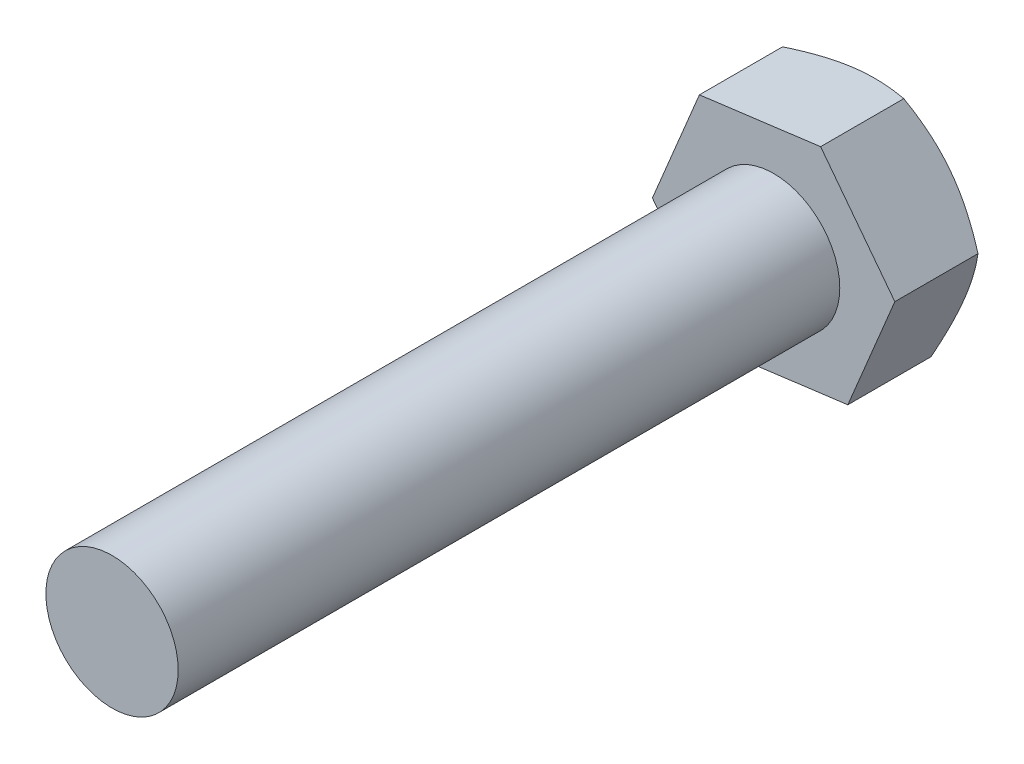
ISO-10303-21;
HEADER;
FILE_DESCRIPTION(('STEP AP214'),'2;1');
FILE_NAME('part.step','',(''),(''),'','','');
FILE_SCHEMA(('AUTOMOTIVE_DESIGN { 1 0 10303 214 1 1 1 1 }'));
ENDSEC;
DATA;
#1=APPLICATION_CONTEXT('core data for automotive mechanical design processes');
#2=APPLICATION_PROTOCOL_DEFINITION('international standard','automotive_design',2000,#1);
#3=PRODUCT_CONTEXT('',#1,'mechanical');
#4=PRODUCT('Part','Part','',(#3));
#5=PRODUCT_RELATED_PRODUCT_CATEGORY('part','',(#4));
#6=PRODUCT_DEFINITION_FORMATION('','',#4);
#7=PRODUCT_DEFINITION_CONTEXT('part definition',#1,'design');
#8=PRODUCT_DEFINITION('design','',#6,#7);
#9=PRODUCT_DEFINITION_SHAPE('','',#8);
#10=(LENGTH_UNIT() NAMED_UNIT(*) SI_UNIT(.MILLI.,.METRE.));
#11=(NAMED_UNIT(*) PLANE_ANGLE_UNIT() SI_UNIT($,.RADIAN.));
#12=(NAMED_UNIT(*) SI_UNIT($,.STERADIAN.) SOLID_ANGLE_UNIT());
#13=UNCERTAINTY_MEASURE_WITH_UNIT(LENGTH_MEASURE(1.E-05),#10,'distance_accuracy_value','');
#14=(GEOMETRIC_REPRESENTATION_CONTEXT(3) GLOBAL_UNCERTAINTY_ASSIGNED_CONTEXT((#13)) GLOBAL_UNIT_ASSIGNED_CONTEXT((#10,
#11,#12)) REPRESENTATION_CONTEXT('',''));
#15=CARTESIAN_POINT('',(0.,0.,0.));
#16=DIRECTION('',(0.,0.,1.));
#17=DIRECTION('',(1.,0.,0.));
#18=AXIS2_PLACEMENT_3D('',#15,#16,#17);
#19=CARTESIAN_POINT('',(4.58048477366729,0.593710848423281,3.5));
#20=DIRECTION('',(-0.794569810407994,-0.607172806034826,0.));
#21=DIRECTION('',(0.607172806034826,-0.794569810407994,0.));
#22=AXIS2_PLACEMENT_3D('',#19,#20,#21);
#23=PLANE('',#22);
#24=CARTESIAN_POINT('',(1.77592087902141,4.26387159985532,0.357338254872102));
#25=CARTESIAN_POINT('',(1.89916034033742,4.10259567570428,0.298723377021481));
#26=CARTESIAN_POINT('',(2.02346359724031,3.93992762751643,0.245415301794976));
#27=CARTESIAN_POINT('',(2.27422254903146,3.61177476756873,0.152365565512237));
#28=CARTESIAN_POINT('',(2.40068269952803,3.44628412502757,0.112656821951731));
#29=CARTESIAN_POINT('',(2.65203576582123,3.11735378387095,0.0508444374808621));
#30=CARTESIAN_POINT('',(2.77689000805798,2.95396469497128,0.0283294014569531));
#31=CARTESIAN_POINT('',(3.02718596964246,2.6264177219096,0.00145122565342501));
#32=CARTESIAN_POINT('',(3.15262677924188,2.46226102827943,-0.00293417167863978));
#33=CARTESIAN_POINT('',(3.38701961896523,2.15552549538191,0.00618934489947468));
#34=CARTESIAN_POINT('',(3.49600673812342,2.01290073724761,0.0174581261467196));
#35=CARTESIAN_POINT('',(3.7132709266397,1.72858041960163,0.0531734331968315));
#36=CARTESIAN_POINT('',(3.82154724453213,1.58688584348695,0.0776321592242175));
#37=CARTESIAN_POINT('',(4.03925938482399,1.30197931882731,0.138777036935456));
#38=CARTESIAN_POINT('',(4.14866765249129,1.15880342947023,0.175722377967157));
#39=CARTESIAN_POINT('',(4.36585239519808,0.874587077682324,0.259573756306608));
#40=CARTESIAN_POINT('',(4.47363165266461,0.733542974059906,0.3064600916069));
#41=CARTESIAN_POINT('',(4.58063760424254,0.593510848423282,0.357338254872103));
#42=B_SPLINE_CURVE_WITH_KNOTS('',3,(#24,#25,#26,#27,#28,#29,#30,#31,#32,#33,#34,#35,#36,#37,#38,
#39,#40,#41),.UNSPECIFIED.,.F.,.F.,(4,2,2,2,2,2,2,2,4),(0.,0.634049257774649,1.26962257534635,
1.88946574143037,2.50854770667068,3.04759288467136,3.58713751741915,4.13865010118638,
4.68907969483178),.UNSPECIFIED.);
#43=CARTESIAN_POINT('',(1.77607370959667,4.26367159985532,0.357265589908161));
#44=VERTEX_POINT('',#43);
#45=CARTESIAN_POINT('',(3.17827924163198,2.4286912241393,0.));
#46=VERTEX_POINT('',#45);
#47=EDGE_CURVE('E111',#44,#46,#42,.T.);
#48=ORIENTED_EDGE('',*,*,#47,.F.);
#49=DIRECTION('',(0.,0.,-1.));
#50=VECTOR('',#49,1.);
#51=CARTESIAN_POINT('',(1.77607370959667,4.26367159985532,3.5));
#52=LINE('',#51,#50);
#53=CARTESIAN_POINT('',(1.77607370959667,4.26367159985532,3.5));
#54=VERTEX_POINT('',#53);
#55=EDGE_CURVE('E134',#54,#44,#52,.T.);
#56=ORIENTED_EDGE('',*,*,#55,.F.);
#57=DIRECTION('',(-0.607172806034826,0.794569810407994,0.));
#58=VECTOR('',#57,1.);
#59=CARTESIAN_POINT('',(4.58048477366729,0.593710848423281,3.5));
#60=LINE('',#59,#58);
#61=CARTESIAN_POINT('',(4.58048477366729,0.593710848423281,3.5));
#62=VERTEX_POINT('',#61);
#63=EDGE_CURVE('E226',#62,#54,#60,.T.);
#64=ORIENTED_EDGE('',*,*,#63,.F.);
#65=DIRECTION('',(0.,0.,-1.));
#66=VECTOR('',#65,1.);
#67=CARTESIAN_POINT('',(4.58048477366729,0.593710848423281,3.5));
#68=LINE('',#67,#66);
#69=CARTESIAN_POINT('',(4.58048477366729,0.593710848423281,0.357265589908163));
#70=VERTEX_POINT('',#69);
#71=EDGE_CURVE('E142',#62,#70,#68,.T.);
#72=ORIENTED_EDGE('',*,*,#71,.T.);
#73=EDGE_CURVE('E123',#46,#70,#42,.T.);
#74=ORIENTED_EDGE('',*,*,#73,.F.);
#75=EDGE_LOOP('',(#48,#56,#64,#72,#74));
#76=FACE_BOUND('',#75,.T.);
#77=ADVANCED_FACE('F38',(#76),#23,.F.);
#78=CARTESIAN_POINT('',(1.77607370959667,4.26367159985532,3.5));
#79=DIRECTION('',(0.128542169309243,-0.991704043910921,0.));
#80=DIRECTION('',(0.991704043910921,0.128542169309243,0.));
#81=AXIS2_PLACEMENT_3D('',#78,#79,#80);
#82=PLANE('',#81);
#83=CARTESIAN_POINT('',(-2.80461106407061,3.66993482793801,0.357323809815519));
#84=CARTESIAN_POINT('',(-2.60332312350505,3.69602526156582,0.298710118318173));
#85=CARTESIAN_POINT('',(-2.40029767574349,3.72234090648074,0.245403303206271));
#86=CARTESIAN_POINT('',(-1.99073125526633,3.77542786976138,0.152356182281905));
#87=CARTESIAN_POINT('',(-1.78418300567893,3.8022001313368,0.112648792320666));
#88=CARTESIAN_POINT('',(-1.37364625676757,3.85541286613429,0.0508390838091549));
#89=CARTESIAN_POINT('',(-1.16972091983387,3.88184515240712,0.0283253783099209));
#90=CARTESIAN_POINT('',(-0.76091081377419,3.93483408412633,0.0014497741584225));
#91=CARTESIAN_POINT('',(-0.556027530346744,3.96139053700021,-0.00293438095799737));
#92=CARTESIAN_POINT('',(-0.173198733399603,4.01101183716107,0.00619109894191353));
#93=CARTESIAN_POINT('',(0.00480411739066283,4.03408411635999,0.0174601206127294));
#94=CARTESIAN_POINT('',(0.359650143610529,4.08007836057138,0.0531747765784102));
#95=CARTESIAN_POINT('',(0.53649209189565,4.10300016652449,0.0776326085119725));
#96=CARTESIAN_POINT('',(0.892069614709291,4.14908922547379,0.138774695152565));
#97=CARTESIAN_POINT('',(1.07076019019486,4.17225064580788,0.175718103295114));
#98=CARTESIAN_POINT('',(1.42547636592586,4.21822805912741,0.259564881404582));
#99=CARTESIAN_POINT('',(1.60150650985015,4.24104464105301,0.306448553012853));
#100=CARTESIAN_POINT('',(1.77627370959667,4.26369752334935,0.357323809815519));
#101=B_SPLINE_CURVE_WITH_KNOTS('',3,(#83,#84,#85,#86,#87,#88,#89,#90,#91,#92,#93,#94,#95,#96,
#97,#98,#99,#100),.UNSPECIFIED.,.F.,.F.,(4,2,2,2,2,2,2,2,4),(0.,0.634045831706041,
1.26961562938643,1.88945569676587,2.5085346006914,3.04755763622061,3.58708004301343,
4.13856922470265,4.68897558224312),.UNSPECIFIED.);
#102=CARTESIAN_POINT('',(-2.80441106407061,3.66996075143204,0.357265589908161));
#103=VERTEX_POINT('',#102);
#104=CARTESIAN_POINT('',(-0.514168677236973,3.96681617564368,0.));
#105=VERTEX_POINT('',#104);
#106=EDGE_CURVE('E55',#103,#105,#101,.T.);
#107=ORIENTED_EDGE('',*,*,#106,.F.);
#108=DIRECTION('',(0.,0.,-1.));
#109=VECTOR('',#108,1.);
#110=CARTESIAN_POINT('',(-2.80441106407061,3.66996075143204,3.5));
#111=LINE('',#110,#109);
#112=CARTESIAN_POINT('',(-2.80441106407061,3.66996075143204,3.5));
#113=VERTEX_POINT('',#112);
#114=EDGE_CURVE('E250',#113,#103,#111,.T.);
#115=ORIENTED_EDGE('',*,*,#114,.F.);
#116=DIRECTION('',(-0.991704043910921,-0.128542169309243,0.));
#117=VECTOR('',#116,1.);
#118=CARTESIAN_POINT('',(1.77607370959667,4.26367159985532,3.5));
#119=LINE('',#118,#117);
#120=EDGE_CURVE('E228',#54,#113,#119,.T.);
#121=ORIENTED_EDGE('',*,*,#120,.F.);
#122=ORIENTED_EDGE('',*,*,#55,.T.);
#123=EDGE_CURVE('E117',#105,#44,#101,.T.);
#124=ORIENTED_EDGE('',*,*,#123,.F.);
#125=EDGE_LOOP('',(#107,#115,#121,#122,#124));
#126=FACE_BOUND('',#125,.T.);
#127=ADVANCED_FACE('F211',(#126),#82,.F.);
#128=CARTESIAN_POINT('',(-2.80441106407061,3.66996075143204,3.5));
#129=DIRECTION('',(0.923111979717238,-0.384531237876096,0.));
#130=DIRECTION('',(0.384531237876096,0.923111979717238,0.));
#131=AXIS2_PLACEMENT_3D('',#128,#129,#130);
#132=PLANE('',#131);
#133=CARTESIAN_POINT('',(-4.5805680856048,-0.593910848423278,0.35732813601233));
#134=CARTESIAN_POINT('',(-4.50251899639098,-0.406544928147875,0.298714089207847));
#135=CARTESIAN_POINT('',(-4.42379619165037,-0.21756167535838,0.245406896697604));
#136=CARTESIAN_POINT('',(-4.26498743485521,0.163677223960533,0.152358992486072));
#137=CARTESIAN_POINT('',(-4.18489866114595,0.355939644200373,0.11265119712853));
#138=CARTESIAN_POINT('',(-4.02571365596991,0.738081771536991,0.050840687180739));
#139=CARTESIAN_POINT('',(-3.94664191602066,0.927902683896143,0.0283265831962528));
#140=CARTESIAN_POINT('',(-3.78812640631579,1.30843760945322,0.00145020884889676));
#141=CARTESIAN_POINT('',(-3.70868321266074,1.49915023965469,-0.00293431830406342));
#142=CARTESIAN_POINT('',(-3.56024114676557,1.85550269122315,0.00619057360030115));
#143=CARTESIAN_POINT('',(-3.49122004511665,2.02119587687256,0.0174595232716789));
#144=CARTESIAN_POINT('',(-3.35362751046443,2.35150276626513,0.0531743742410887));
#145=CARTESIAN_POINT('',(-3.28505655331122,2.51611532767476,0.0776324739522186));
#146=CARTESIAN_POINT('',(-3.14718036497787,2.84710316073419,0.138775396502332));
#147=CARTESIAN_POINT('',(-3.07789258283997,3.01343654392774,0.175719383532039));
#148=CARTESIAN_POINT('',(-2.940350386942,3.3436225892834,0.259567539378517));
#149=CARTESIAN_POINT('',(-2.87209421127525,3.50747948110753,0.306452008743888));
#150=CARTESIAN_POINT('',(-2.8043277521331,3.67016075143204,0.357328136012331));
#151=B_SPLINE_CURVE_WITH_KNOTS('',3,(#133,#134,#135,#136,#137,#138,#139,#140,#141,#142,#143,
#144,#145,#146,#147,#148,#149,#150),.UNSPECIFIED.,.F.,.F.,(4,2,2,2,2,2,2,2,4),(0.,
0.634046857790791,1.2696177096552,1.88945870507563,2.5085385258442,3.04756819293739,
3.58709725629624,4.13859344678765,4.68900676342385),.UNSPECIFIED.);
#152=CARTESIAN_POINT('',(-4.58048477366728,-0.593710848423278,0.35726558990816));
#153=VERTEX_POINT('',#152);
#154=CARTESIAN_POINT('',(-3.69244791886895,1.53812495150438,0.));
#155=VERTEX_POINT('',#154);
#156=EDGE_CURVE('E63',#153,#155,#151,.T.);
#157=ORIENTED_EDGE('',*,*,#156,.F.);
#158=DIRECTION('',(0.,0.,-1.));
#159=VECTOR('',#158,1.);
#160=CARTESIAN_POINT('',(-4.58048477366728,-0.593710848423278,3.5));
#161=LINE('',#160,#159);
#162=CARTESIAN_POINT('',(-4.58048477366728,-0.593710848423278,3.5));
#163=VERTEX_POINT('',#162);
#164=EDGE_CURVE('E247',#163,#153,#161,.T.);
#165=ORIENTED_EDGE('',*,*,#164,.F.);
#166=DIRECTION('',(-0.384531237876095,-0.923111979717238,0.));
#167=VECTOR('',#166,1.);
#168=CARTESIAN_POINT('',(-2.80441106407061,3.66996075143204,3.5));
#169=LINE('',#168,#167);
#170=EDGE_CURVE('E230',#113,#163,#169,.T.);
#171=ORIENTED_EDGE('',*,*,#170,.F.);
#172=ORIENTED_EDGE('',*,*,#114,.T.);
#173=EDGE_CURVE('E179',#155,#103,#151,.T.);
#174=ORIENTED_EDGE('',*,*,#173,.F.);
#175=EDGE_LOOP('',(#157,#165,#171,#172,#174));
#176=FACE_BOUND('',#175,.T.);
#177=ADVANCED_FACE('F207',(#176),#132,.F.);
#178=CARTESIAN_POINT('',(-4.58048477366728,-0.593710848423278,3.5));
#179=DIRECTION('',(0.794569810407994,0.607172806034826,0.));
#180=DIRECTION('',(-0.607172806034826,0.794569810407994,0.));
#181=AXIS2_PLACEMENT_3D('',#178,#179,#180);
#182=PLANE('',#181);
#183=CARTESIAN_POINT('',(-1.77592087902141,-4.26387159985532,0.357338254872101));
#184=CARTESIAN_POINT('',(-1.89916034033742,-4.10259567570428,0.298723377021479));
#185=CARTESIAN_POINT('',(-2.02346359724031,-3.93992762751643,0.245415301794975));
#186=CARTESIAN_POINT('',(-2.27422254903146,-3.61177476756873,0.152365565512235));
#187=CARTESIAN_POINT('',(-2.40068269952802,-3.44628412502757,0.112656821951729));
#188=CARTESIAN_POINT('',(-2.65203576582122,-3.11735378387095,0.0508444374808602));
#189=CARTESIAN_POINT('',(-2.77689000805797,-2.95396469497128,0.0283294014569512));
#190=CARTESIAN_POINT('',(-3.02718596964246,-2.6264177219096,0.00145122565342287));
#191=CARTESIAN_POINT('',(-3.15262677924187,-2.46226102827943,-0.00293417167864211));
#192=CARTESIAN_POINT('',(-3.38701961896523,-2.15552549538191,0.0061893448994718));
#193=CARTESIAN_POINT('',(-3.49600673812342,-2.01290073724761,0.0174581261467164));
#194=CARTESIAN_POINT('',(-3.7132709266397,-1.72858041960163,0.0531734331968281));
#195=CARTESIAN_POINT('',(-3.82154724453213,-1.58688584348695,0.0776321592242141));
#196=CARTESIAN_POINT('',(-4.03925938482399,-1.30197931882731,0.138777036935453));
#197=CARTESIAN_POINT('',(-4.14866765249129,-1.15880342947023,0.175722377967154));
#198=CARTESIAN_POINT('',(-4.36585239519808,-0.874587077682321,0.259573756306606));
#199=CARTESIAN_POINT('',(-4.4736316526646,-0.733542974059904,0.306460091606898));
#200=CARTESIAN_POINT('',(-4.58063760424254,-0.593510848423279,0.357338254872101));
#201=B_SPLINE_CURVE_WITH_KNOTS('',3,(#183,#184,#185,#186,#187,#188,#189,#190,#191,#192,#193,
#194,#195,#196,#197,#198,#199,#200),.UNSPECIFIED.,.F.,.F.,(4,2,2,2,2,2,2,2,4),(0.,
0.634049257774649,1.26962257534635,1.88946574143037,2.50854770667068,3.04759288467136,
3.58713751741915,4.13865010118639,4.68907969483178),.UNSPECIFIED.);
#202=CARTESIAN_POINT('',(-1.77607370959666,-4.26367159985532,0.35726558990816));
#203=VERTEX_POINT('',#202);
#204=CARTESIAN_POINT('',(-3.17827924163198,-2.4286912241393,0.));
#205=VERTEX_POINT('',#204);
#206=EDGE_CURVE('E157',#203,#205,#201,.T.);
#207=ORIENTED_EDGE('',*,*,#206,.F.);
#208=DIRECTION('',(0.,0.,-1.));
#209=VECTOR('',#208,1.);
#210=CARTESIAN_POINT('',(-1.77607370959666,-4.26367159985532,3.5));
#211=LINE('',#210,#209);
#212=CARTESIAN_POINT('',(-1.77607370959666,-4.26367159985532,3.5));
#213=VERTEX_POINT('',#212);
#214=EDGE_CURVE('E244',#213,#203,#211,.T.);
#215=ORIENTED_EDGE('',*,*,#214,.F.);
#216=DIRECTION('',(0.607172806034826,-0.794569810407994,0.));
#217=VECTOR('',#216,1.);
#218=CARTESIAN_POINT('',(-4.58048477366728,-0.593710848423278,3.5));
#219=LINE('',#218,#217);
#220=EDGE_CURVE('E234',#163,#213,#219,.T.);
#221=ORIENTED_EDGE('',*,*,#220,.F.);
#222=ORIENTED_EDGE('',*,*,#164,.T.);
#223=EDGE_CURVE('E220',#205,#153,#201,.T.);
#224=ORIENTED_EDGE('',*,*,#223,.F.);
#225=EDGE_LOOP('',(#207,#215,#221,#222,#224));
#226=FACE_BOUND('',#225,.T.);
#227=ADVANCED_FACE('F203',(#226),#182,.F.);
#228=CARTESIAN_POINT('',(-1.77607370959666,-4.26367159985532,3.5));
#229=DIRECTION('',(-0.128542169309244,0.991704043910921,0.));
#230=DIRECTION('',(-0.991704043910921,-0.128542169309244,0.));
#231=AXIS2_PLACEMENT_3D('',#228,#229,#230);
#232=PLANE('',#231);
#233=CARTESIAN_POINT('',(2.80461106407062,-3.66993482793801,0.357323809815519));
#234=CARTESIAN_POINT('',(2.60332312350505,-3.69602526156582,0.298710118318173));
#235=CARTESIAN_POINT('',(2.4002976757435,-3.72234090648074,0.245403303206271));
#236=CARTESIAN_POINT('',(1.99073125526634,-3.77542786976138,0.152356182281905));
#237=CARTESIAN_POINT('',(1.78418300567893,-3.8022001313368,0.112648792320666));
#238=CARTESIAN_POINT('',(1.37364625676757,-3.85541286613429,0.0508390838091548));
#239=CARTESIAN_POINT('',(1.16972091983387,-3.88184515240712,0.0283253783099208));
#240=CARTESIAN_POINT('',(0.760910813774194,-3.93483408412633,0.00144977415842204));
#241=CARTESIAN_POINT('',(0.556027530346747,-3.96139053700021,-0.00293438095799812));
#242=CARTESIAN_POINT('',(0.173198733399607,-4.01101183716106,0.00619109894191277));
#243=CARTESIAN_POINT('',(-0.00480411739065936,-4.03408411635998,0.0174601206127288));
#244=CARTESIAN_POINT('',(-0.359650143610525,-4.08007836057138,0.0531747765784095));
#245=CARTESIAN_POINT('',(-0.536492091895646,-4.10300016652449,0.0776326085119714));
#246=CARTESIAN_POINT('',(-0.892069614709287,-4.14908922547379,0.138774695152564));
#247=CARTESIAN_POINT('',(-1.07076019019485,-4.17225064580788,0.175718103295112));
#248=CARTESIAN_POINT('',(-1.42547636592586,-4.21822805912741,0.259564881404582));
#249=CARTESIAN_POINT('',(-1.60150650985014,-4.24104464105301,0.306448553012852));
#250=CARTESIAN_POINT('',(-1.77627370959667,-4.26369752334935,0.357323809815518));
#251=B_SPLINE_CURVE_WITH_KNOTS('',3,(#233,#234,#235,#236,#237,#238,#239,#240,#241,#242,#243,
#244,#245,#246,#247,#248,#249,#250),.UNSPECIFIED.,.F.,.F.,(4,2,2,2,2,2,2,2,4),(0.,
0.634045831706041,1.26961562938643,1.88945569676587,2.5085346006914,3.04755763622061,
3.58708004301343,4.13856922470265,4.68897558224312),.UNSPECIFIED.);
#252=CARTESIAN_POINT('',(2.80441106407062,-3.66996075143204,0.357265589908161));
#253=VERTEX_POINT('',#252);
#254=CARTESIAN_POINT('',(0.514168677236974,-3.96681617564368,0.));
#255=VERTEX_POINT('',#254);
#256=EDGE_CURVE('E143',#253,#255,#251,.T.);
#257=ORIENTED_EDGE('',*,*,#256,.F.);
#258=DIRECTION('',(0.,0.,-1.));
#259=VECTOR('',#258,1.);
#260=CARTESIAN_POINT('',(2.80441106407062,-3.66996075143204,3.5));
#261=LINE('',#260,#259);
#262=CARTESIAN_POINT('',(2.80441106407062,-3.66996075143204,3.5));
#263=VERTEX_POINT('',#262);
#264=EDGE_CURVE('E241',#263,#253,#261,.T.);
#265=ORIENTED_EDGE('',*,*,#264,.F.);
#266=DIRECTION('',(0.991704043910921,0.128542169309244,0.));
#267=VECTOR('',#266,1.);
#268=CARTESIAN_POINT('',(-1.77607370959666,-4.26367159985532,3.5));
#269=LINE('',#268,#267);
#270=EDGE_CURVE('E236',#213,#263,#269,.T.);
#271=ORIENTED_EDGE('',*,*,#270,.F.);
#272=ORIENTED_EDGE('',*,*,#214,.T.);
#273=EDGE_CURVE('E122',#255,#203,#251,.T.);
#274=ORIENTED_EDGE('',*,*,#273,.F.);
#275=EDGE_LOOP('',(#257,#265,#271,#272,#274));
#276=FACE_BOUND('',#275,.T.);
#277=ADVANCED_FACE('F199',(#276),#232,.F.);
#278=CARTESIAN_POINT('',(2.80441106407062,-3.66996075143204,3.5));
#279=DIRECTION('',(-0.923111979717238,0.384531237876096,0.));
#280=DIRECTION('',(-0.384531237876096,-0.923111979717238,0.));
#281=AXIS2_PLACEMENT_3D('',#278,#279,#280);
#282=PLANE('',#281);
#283=CARTESIAN_POINT('',(4.5805680856048,0.593910848423281,0.357328136012333));
#284=CARTESIAN_POINT('',(4.50251899639099,0.406544928147877,0.29871408920785));
#285=CARTESIAN_POINT('',(4.42379619165038,0.217561675358383,0.245406896697606));
#286=CARTESIAN_POINT('',(4.26498743485521,-0.16367722396053,0.152358992486074));
#287=CARTESIAN_POINT('',(4.18489866114595,-0.355939644200371,0.112651197128533));
#288=CARTESIAN_POINT('',(4.02571365596991,-0.738081771536988,0.0508406871807409));
#289=CARTESIAN_POINT('',(3.94664191602066,-0.927902683896141,0.0283265831962547));
#290=CARTESIAN_POINT('',(3.78812640631579,-1.30843760945322,0.00145020884889833));
#291=CARTESIAN_POINT('',(3.70868321266074,-1.49915023965468,-0.00293431830406227));
#292=CARTESIAN_POINT('',(3.56024114676557,-1.85550269122315,0.0061905736003019));
#293=CARTESIAN_POINT('',(3.49122004511665,-2.02119587687256,0.0174595232716796));
#294=CARTESIAN_POINT('',(3.35362751046443,-2.35150276626512,0.0531743742410895));
#295=CARTESIAN_POINT('',(3.28505655331122,-2.51611532767475,0.0776324739522196));
#296=CARTESIAN_POINT('',(3.14718036497787,-2.84710316073418,0.138775396502333));
#297=CARTESIAN_POINT('',(3.07789258283997,-3.01343654392774,0.175719383532039));
#298=CARTESIAN_POINT('',(2.94035038694201,-3.3436225892834,0.259567539378517));
#299=CARTESIAN_POINT('',(2.87209421127525,-3.50747948110753,0.306452008743888));
#300=CARTESIAN_POINT('',(2.8043277521331,-3.67016075143204,0.357328136012331));
#301=B_SPLINE_CURVE_WITH_KNOTS('',3,(#283,#284,#285,#286,#287,#288,#289,#290,#291,#292,#293,
#294,#295,#296,#297,#298,#299,#300),.UNSPECIFIED.,.F.,.F.,(4,2,2,2,2,2,2,2,4),(0.,
0.634046857790791,1.2696177096552,1.88945870507563,2.5085385258442,3.0475681929374,
3.58709725629624,4.13859344678765,4.68900676342385),.UNSPECIFIED.);
#302=CARTESIAN_POINT('',(3.69244791886895,-1.53812495150438,0.));
#303=VERTEX_POINT('',#302);
#304=EDGE_CURVE('E129',#70,#303,#301,.T.);
#305=ORIENTED_EDGE('',*,*,#304,.F.);
#306=ORIENTED_EDGE('',*,*,#71,.F.);
#307=DIRECTION('',(0.384531237876095,0.923111979717237,0.));
#308=VECTOR('',#307,1.);
#309=CARTESIAN_POINT('',(2.80441106407062,-3.66996075143204,3.5));
#310=LINE('',#309,#308);
#311=EDGE_CURVE('E238',#263,#62,#310,.T.);
#312=ORIENTED_EDGE('',*,*,#311,.F.);
#313=ORIENTED_EDGE('',*,*,#264,.T.);
#314=EDGE_CURVE('E188',#303,#253,#301,.T.);
#315=ORIENTED_EDGE('',*,*,#314,.F.);
#316=EDGE_LOOP('',(#305,#306,#312,#313,#315));
#317=FACE_BOUND('',#316,.T.);
#318=ADVANCED_FACE('F196',(#317),#282,.F.);
#319=CARTESIAN_POINT('',(0.,0.,3.5));
#320=DIRECTION('',(0.,0.,1.));
#321=DIRECTION('',(1.,0.,0.));
#322=AXIS2_PLACEMENT_3D('',#319,#320,#321);
#323=PLANE('',#322);
#324=CARTESIAN_POINT('',(0.,0.,3.5));
#325=DIRECTION('',(0.,0.,1.));
#326=DIRECTION('',(1.,0.,0.));
#327=AXIS2_PLACEMENT_3D('',#324,#325,#326);
#328=CIRCLE('',#327,2.5);
#329=CARTESIAN_POINT('',(2.5,0.,3.5));
#330=VERTEX_POINT('',#329);
#331=EDGE_CURVE('E12',#330,#330,#328,.T.);
#332=ORIENTED_EDGE('',*,*,#331,.F.);
#333=EDGE_LOOP('',(#332));
#334=FACE_BOUND('',#333,.T.);
#335=ORIENTED_EDGE('',*,*,#63,.T.);
#336=ORIENTED_EDGE('',*,*,#120,.T.);
#337=ORIENTED_EDGE('',*,*,#170,.T.);
#338=ORIENTED_EDGE('',*,*,#220,.T.);
#339=ORIENTED_EDGE('',*,*,#270,.T.);
#340=ORIENTED_EDGE('',*,*,#311,.T.);
#341=EDGE_LOOP('',(#335,#336,#337,#338,#339,#340));
#342=FACE_BOUND('',#341,.T.);
#343=ADVANCED_FACE('F174',(#334,#342),#323,.T.);
#344=CARTESIAN_POINT('',(0.,0.,0.));
#345=DIRECTION('',(0.,0.,1.));
#346=DIRECTION('',(-1.,0.,0.));
#347=AXIS2_PLACEMENT_3D('',#344,#345,#346);
#348=CONICAL_SURFACE('',#347,4.,1.0471975511966);
#349=ORIENTED_EDGE('',*,*,#73,.T.);
#350=ORIENTED_EDGE('',*,*,#304,.T.);
#351=CARTESIAN_POINT('',(0.,0.,0.));
#352=DIRECTION('',(0.,0.,1.));
#353=DIRECTION('',(1.,0.,0.));
#354=AXIS2_PLACEMENT_3D('',#351,#352,#353);
#355=CIRCLE('',#354,4.);
#356=EDGE_CURVE('E42',#303,#46,#355,.T.);
#357=ORIENTED_EDGE('',*,*,#356,.T.);
#358=EDGE_LOOP('',(#349,#350,#357));
#359=FACE_BOUND('',#358,.T.);
#360=ADVANCED_FACE('F127',(#359),#348,.T.);
#361=ORIENTED_EDGE('',*,*,#256,.T.);
#362=EDGE_CURVE('E133',#255,#303,#355,.T.);
#363=ORIENTED_EDGE('',*,*,#362,.T.);
#364=ORIENTED_EDGE('',*,*,#314,.T.);
#365=EDGE_LOOP('',(#361,#363,#364));
#366=FACE_BOUND('',#365,.T.);
#367=ADVANCED_FACE('F171',(#366),#348,.T.);
#368=ORIENTED_EDGE('',*,*,#206,.T.);
#369=EDGE_CURVE('E265',#205,#255,#355,.T.);
#370=ORIENTED_EDGE('',*,*,#369,.T.);
#371=ORIENTED_EDGE('',*,*,#273,.T.);
#372=EDGE_LOOP('',(#368,#370,#371));
#373=FACE_BOUND('',#372,.T.);
#374=ADVANCED_FACE('F170',(#373),#348,.T.);
#375=ORIENTED_EDGE('',*,*,#156,.T.);
#376=EDGE_CURVE('E138',#155,#205,#355,.T.);
#377=ORIENTED_EDGE('',*,*,#376,.T.);
#378=ORIENTED_EDGE('',*,*,#223,.T.);
#379=EDGE_LOOP('',(#375,#377,#378));
#380=FACE_BOUND('',#379,.T.);
#381=ADVANCED_FACE('F164',(#380),#348,.T.);
#382=ORIENTED_EDGE('',*,*,#173,.T.);
#383=ORIENTED_EDGE('',*,*,#106,.T.);
#384=CARTESIAN_POINT('',(0.,0.,0.));
#385=DIRECTION('',(0.,0.,-1.));
#386=DIRECTION('',(-1.,0.,0.));
#387=AXIS2_PLACEMENT_3D('',#384,#385,#386);
#388=CIRCLE('',#387,4.);
#389=EDGE_CURVE('E137',#155,#105,#388,.T.);
#390=ORIENTED_EDGE('',*,*,#389,.F.);
#391=EDGE_LOOP('',(#382,#383,#390));
#392=FACE_BOUND('',#391,.T.);
#393=ADVANCED_FACE('F169',(#392),#348,.T.);
#394=ORIENTED_EDGE('',*,*,#123,.T.);
#395=ORIENTED_EDGE('',*,*,#47,.T.);
#396=EDGE_CURVE('E47',#46,#105,#355,.T.);
#397=ORIENTED_EDGE('',*,*,#396,.T.);
#398=EDGE_LOOP('',(#394,#395,#397));
#399=FACE_BOUND('',#398,.T.);
#400=ADVANCED_FACE('F113',(#399),#348,.T.);
#401=CARTESIAN_POINT('',(0.,0.,0.));
#402=DIRECTION('',(0.,0.,1.));
#403=DIRECTION('',(1.,0.,0.));
#404=AXIS2_PLACEMENT_3D('',#401,#402,#403);
#405=PLANE('',#404);
#406=ORIENTED_EDGE('',*,*,#396,.F.);
#407=ORIENTED_EDGE('',*,*,#356,.F.);
#408=ORIENTED_EDGE('',*,*,#362,.F.);
#409=ORIENTED_EDGE('',*,*,#369,.F.);
#410=ORIENTED_EDGE('',*,*,#376,.F.);
#411=ORIENTED_EDGE('',*,*,#389,.T.);
#412=EDGE_LOOP('',(#406,#407,#408,#409,#410,#411));
#413=FACE_BOUND('',#412,.T.);
#414=ADVANCED_FACE('F135',(#413),#405,.F.);
#415=CARTESIAN_POINT('',(0.,0.,28.5));
#416=DIRECTION('',(0.,0.,-1.));
#417=DIRECTION('',(-1.,0.,0.));
#418=AXIS2_PLACEMENT_3D('',#415,#416,#417);
#419=CYLINDRICAL_SURFACE('',#418,2.5);
#420=CARTESIAN_POINT('',(0.,0.,28.5));
#421=DIRECTION('',(0.,0.,1.));
#422=DIRECTION('',(1.,0.,0.));
#423=AXIS2_PLACEMENT_3D('',#420,#421,#422);
#424=CIRCLE('',#423,2.5);
#425=CARTESIAN_POINT('',(2.5,0.,28.5));
#426=VERTEX_POINT('',#425);
#427=EDGE_CURVE('E362',#426,#426,#424,.T.);
#428=ORIENTED_EDGE('',*,*,#427,.F.);
#429=EDGE_LOOP('',(#428));
#430=FACE_BOUND('',#429,.T.);
#431=ORIENTED_EDGE('',*,*,#331,.T.);
#432=EDGE_LOOP('',(#431));
#433=FACE_BOUND('',#432,.T.);
#434=ADVANCED_FACE('F172',(#430,#433),#419,.T.);
#435=CARTESIAN_POINT('',(0.,0.,28.5));
#436=DIRECTION('',(0.,0.,1.));
#437=DIRECTION('',(1.,0.,0.));
#438=AXIS2_PLACEMENT_3D('',#435,#436,#437);
#439=PLANE('',#438);
#440=ORIENTED_EDGE('',*,*,#427,.T.);
#441=EDGE_LOOP('',(#440));
#442=FACE_BOUND('',#441,.T.);
#443=ADVANCED_FACE('F348',(#442),#439,.T.);
#444=CLOSED_SHELL('',(#77,#127,#177,#227,#277,#318,#343,#360,#367,#374,#381,#393,#400,#414,#434,#443));
#445=MANIFOLD_SOLID_BREP('B2',#444);
#446=ADVANCED_BREP_SHAPE_REPRESENTATION('',(#18,#445),#14);
#447=SHAPE_DEFINITION_REPRESENTATION(#9,#446);
ENDSEC;
END-ISO-10303-21;
